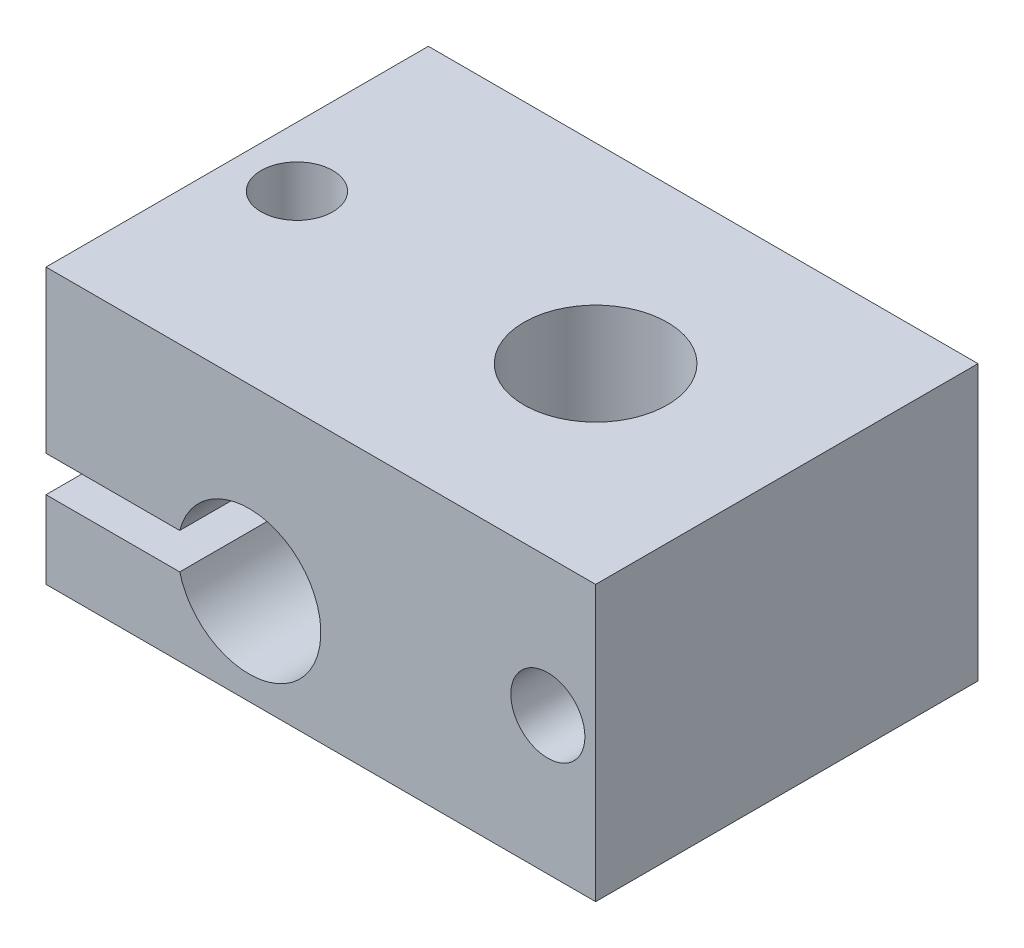
ISO-10303-21;
HEADER;
FILE_DESCRIPTION(('STEP AP214'),'2;1');
FILE_NAME('part.step','',(''),(''),'','','');
FILE_SCHEMA(('AUTOMOTIVE_DESIGN { 1 0 10303 214 1 1 1 1 }'));
ENDSEC;
DATA;
#1=APPLICATION_CONTEXT('core data for automotive mechanical design processes');
#2=APPLICATION_PROTOCOL_DEFINITION('international standard','automotive_design',2000,#1);
#3=PRODUCT_CONTEXT('',#1,'mechanical');
#4=PRODUCT('Part','Part','',(#3));
#5=PRODUCT_RELATED_PRODUCT_CATEGORY('part','',(#4));
#6=PRODUCT_DEFINITION_FORMATION('','',#4);
#7=PRODUCT_DEFINITION_CONTEXT('part definition',#1,'design');
#8=PRODUCT_DEFINITION('design','',#6,#7);
#9=PRODUCT_DEFINITION_SHAPE('','',#8);
#10=(LENGTH_UNIT() NAMED_UNIT(*) SI_UNIT(.MILLI.,.METRE.));
#11=(NAMED_UNIT(*) PLANE_ANGLE_UNIT() SI_UNIT($,.RADIAN.));
#12=(NAMED_UNIT(*) SI_UNIT($,.STERADIAN.) SOLID_ANGLE_UNIT());
#13=UNCERTAINTY_MEASURE_WITH_UNIT(LENGTH_MEASURE(1.E-05),#10,'distance_accuracy_value','');
#14=(GEOMETRIC_REPRESENTATION_CONTEXT(3) GLOBAL_UNCERTAINTY_ASSIGNED_CONTEXT((#13)) GLOBAL_UNIT_ASSIGNED_CONTEXT((#10,
#11,#12)) REPRESENTATION_CONTEXT('',''));
#15=CARTESIAN_POINT('',(0.,0.,0.));
#16=DIRECTION('',(0.,0.,1.));
#17=DIRECTION('',(1.,0.,0.));
#18=AXIS2_PLACEMENT_3D('',#15,#16,#17);
#19=CARTESIAN_POINT('',(-0.296478770186016,-0.816839986956898,16.));
#20=DIRECTION('',(0.,0.,1.));
#21=DIRECTION('',(1.,0.,0.));
#22=AXIS2_PLACEMENT_3D('',#19,#20,#21);
#23=PLANE('',#22);
#24=DIRECTION('',(0.,-1.,0.));
#25=VECTOR('',#24,1.);
#26=CARTESIAN_POINT('',(-8.79647877018601,-1.5668399869569,16.));
#27=LINE('',#26,#25);
#28=CARTESIAN_POINT('',(-8.79647877018601,-1.5668399869569,16.));
#29=VERTEX_POINT('',#28);
#30=CARTESIAN_POINT('',(-8.79647877018601,-4.8168399869569,16.));
#31=VERTEX_POINT('',#30);
#32=EDGE_CURVE('E165',#29,#31,#27,.T.);
#33=ORIENTED_EDGE('',*,*,#32,.T.);
#34=DIRECTION('',(1.,0.,0.));
#35=VECTOR('',#34,1.);
#36=CARTESIAN_POINT('',(14.203521229814,-4.8168399869569,16.));
#37=LINE('',#36,#35);
#38=CARTESIAN_POINT('',(14.203521229814,-4.8168399869569,16.));
#39=VERTEX_POINT('',#38);
#40=EDGE_CURVE('E101',#31,#39,#37,.T.);
#41=ORIENTED_EDGE('',*,*,#40,.T.);
#42=DIRECTION('',(0.,1.,0.));
#43=VECTOR('',#42,1.);
#44=CARTESIAN_POINT('',(14.203521229814,6.68316001304311,16.));
#45=LINE('',#44,#43);
#46=CARTESIAN_POINT('',(14.203521229814,6.68316001304311,16.));
#47=VERTEX_POINT('',#46);
#48=EDGE_CURVE('E187',#39,#47,#45,.T.);
#49=ORIENTED_EDGE('',*,*,#48,.T.);
#50=DIRECTION('',(-1.,0.,0.));
#51=VECTOR('',#50,1.);
#52=CARTESIAN_POINT('',(14.203521229814,6.68316001304311,16.));
#53=LINE('',#52,#51);
#54=CARTESIAN_POINT('',(-8.79647877018601,6.6831600130431,16.));
#55=VERTEX_POINT('',#54);
#56=EDGE_CURVE('E201',#47,#55,#53,.T.);
#57=ORIENTED_EDGE('',*,*,#56,.T.);
#58=DIRECTION('',(0.,-1.,0.));
#59=VECTOR('',#58,1.);
#60=CARTESIAN_POINT('',(-8.79647877018601,6.6831600130431,16.));
#61=LINE('',#60,#59);
#62=CARTESIAN_POINT('',(-8.79647877018601,-0.0668399869568986,16.));
#63=VERTEX_POINT('',#62);
#64=EDGE_CURVE('E120',#55,#63,#61,.T.);
#65=ORIENTED_EDGE('',*,*,#64,.T.);
#66=DIRECTION('',(1.,0.,0.));
#67=VECTOR('',#66,1.);
#68=CARTESIAN_POINT('',(-3.20121627984158,-0.0668399869568979,16.));
#69=LINE('',#68,#67);
#70=CARTESIAN_POINT('',(-3.20121627984158,-0.0668399869568979,16.));
#71=VERTEX_POINT('',#70);
#72=EDGE_CURVE('E114',#63,#71,#69,.T.);
#73=ORIENTED_EDGE('',*,*,#72,.T.);
#74=CARTESIAN_POINT('',(-0.296478770186016,-0.816839986956898,16.));
#75=DIRECTION('',(0.,0.,-1.));
#76=DIRECTION('',(1.,0.,0.));
#77=AXIS2_PLACEMENT_3D('',#74,#75,#76);
#78=CIRCLE('',#77,3.);
#79=CARTESIAN_POINT('',(-3.20121627984158,-1.5668399869569,16.));
#80=VERTEX_POINT('',#79);
#81=EDGE_CURVE('E118',#71,#80,#78,.T.);
#82=ORIENTED_EDGE('',*,*,#81,.T.);
#83=DIRECTION('',(-1.,0.,0.));
#84=VECTOR('',#83,1.);
#85=CARTESIAN_POINT('',(-3.20121627984158,-1.5668399869569,16.));
#86=LINE('',#85,#84);
#87=EDGE_CURVE('E58',#80,#29,#86,.T.);
#88=ORIENTED_EDGE('',*,*,#87,.T.);
#89=EDGE_LOOP('',(#33,#41,#49,#57,#65,#73,#82,#88));
#90=FACE_BOUND('',#89,.T.);
#91=CARTESIAN_POINT('',(12.203521229814,0.933160013043104,16.));
#92=DIRECTION('',(0.,0.,1.));
#93=DIRECTION('',(1.,0.,0.));
#94=AXIS2_PLACEMENT_3D('',#91,#92,#93);
#95=CIRCLE('',#94,1.55);
#96=CARTESIAN_POINT('',(13.753521229814,0.933160013043104,16.));
#97=VERTEX_POINT('',#96);
#98=EDGE_CURVE('E147',#97,#97,#95,.T.);
#99=ORIENTED_EDGE('',*,*,#98,.F.);
#100=EDGE_LOOP('',(#99));
#101=FACE_BOUND('',#100,.T.);
#102=ADVANCED_FACE('F39',(#90,#101),#23,.T.);
#103=CARTESIAN_POINT('',(-0.296478770186016,-0.816839986956898,0.));
#104=DIRECTION('',(0.,0.,1.));
#105=DIRECTION('',(1.,0.,0.));
#106=AXIS2_PLACEMENT_3D('',#103,#104,#105);
#107=PLANE('',#106);
#108=DIRECTION('',(0.,-1.,0.));
#109=VECTOR('',#108,1.);
#110=CARTESIAN_POINT('',(-8.79647877018601,-1.5668399869569,0.));
#111=LINE('',#110,#109);
#112=CARTESIAN_POINT('',(-8.79647877018601,-1.5668399869569,0.));
#113=VERTEX_POINT('',#112);
#114=CARTESIAN_POINT('',(-8.79647877018601,-4.8168399869569,0.));
#115=VERTEX_POINT('',#114);
#116=EDGE_CURVE('E142',#113,#115,#111,.T.);
#117=ORIENTED_EDGE('',*,*,#116,.F.);
#118=DIRECTION('',(-1.,0.,0.));
#119=VECTOR('',#118,1.);
#120=CARTESIAN_POINT('',(-3.20121627984158,-1.5668399869569,0.));
#121=LINE('',#120,#119);
#122=CARTESIAN_POINT('',(-3.20121627984158,-1.5668399869569,0.));
#123=VERTEX_POINT('',#122);
#124=EDGE_CURVE('E93',#123,#113,#121,.T.);
#125=ORIENTED_EDGE('',*,*,#124,.F.);
#126=CARTESIAN_POINT('',(-0.296478770186016,-0.816839986956898,0.));
#127=DIRECTION('',(0.,0.,-1.));
#128=DIRECTION('',(1.,0.,0.));
#129=AXIS2_PLACEMENT_3D('',#126,#127,#128);
#130=CIRCLE('',#129,3.);
#131=CARTESIAN_POINT('',(-3.20121627984158,-0.0668399869568979,0.));
#132=VERTEX_POINT('',#131);
#133=EDGE_CURVE('E87',#132,#123,#130,.T.);
#134=ORIENTED_EDGE('',*,*,#133,.F.);
#135=DIRECTION('',(1.,0.,0.));
#136=VECTOR('',#135,1.);
#137=CARTESIAN_POINT('',(-3.20121627984158,-0.0668399869568979,0.));
#138=LINE('',#137,#136);
#139=CARTESIAN_POINT('',(-8.79647877018601,-0.0668399869568986,0.));
#140=VERTEX_POINT('',#139);
#141=EDGE_CURVE('E129',#140,#132,#138,.T.);
#142=ORIENTED_EDGE('',*,*,#141,.F.);
#143=DIRECTION('',(0.,-1.,0.));
#144=VECTOR('',#143,1.);
#145=CARTESIAN_POINT('',(-8.79647877018601,6.6831600130431,0.));
#146=LINE('',#145,#144);
#147=CARTESIAN_POINT('',(-8.79647877018601,6.6831600130431,0.));
#148=VERTEX_POINT('',#147);
#149=EDGE_CURVE('E156',#148,#140,#146,.T.);
#150=ORIENTED_EDGE('',*,*,#149,.F.);
#151=DIRECTION('',(-1.,0.,0.));
#152=VECTOR('',#151,1.);
#153=CARTESIAN_POINT('',(14.203521229814,6.68316001304311,0.));
#154=LINE('',#153,#152);
#155=CARTESIAN_POINT('',(14.203521229814,6.68316001304311,0.));
#156=VERTEX_POINT('',#155);
#157=EDGE_CURVE('E153',#156,#148,#154,.T.);
#158=ORIENTED_EDGE('',*,*,#157,.F.);
#159=DIRECTION('',(0.,1.,0.));
#160=VECTOR('',#159,1.);
#161=CARTESIAN_POINT('',(14.203521229814,6.68316001304311,0.));
#162=LINE('',#161,#160);
#163=CARTESIAN_POINT('',(14.203521229814,-4.8168399869569,0.));
#164=VERTEX_POINT('',#163);
#165=EDGE_CURVE('E150',#164,#156,#162,.T.);
#166=ORIENTED_EDGE('',*,*,#165,.F.);
#167=DIRECTION('',(1.,0.,0.));
#168=VECTOR('',#167,1.);
#169=CARTESIAN_POINT('',(14.203521229814,-4.8168399869569,0.));
#170=LINE('',#169,#168);
#171=EDGE_CURVE('E146',#115,#164,#170,.T.);
#172=ORIENTED_EDGE('',*,*,#171,.F.);
#173=EDGE_LOOP('',(#117,#125,#134,#142,#150,#158,#166,#172));
#174=FACE_BOUND('',#173,.T.);
#175=CARTESIAN_POINT('',(12.203521229814,0.933160013043104,0.));
#176=DIRECTION('',(0.,0.,1.));
#177=DIRECTION('',(1.,0.,0.));
#178=AXIS2_PLACEMENT_3D('',#175,#176,#177);
#179=CIRCLE('',#178,1.55);
#180=CARTESIAN_POINT('',(13.753521229814,0.933160013043104,0.));
#181=VERTEX_POINT('',#180);
#182=EDGE_CURVE('E211',#181,#181,#179,.T.);
#183=ORIENTED_EDGE('',*,*,#182,.T.);
#184=EDGE_LOOP('',(#183));
#185=FACE_BOUND('',#184,.T.);
#186=ADVANCED_FACE('F191',(#174,#185),#107,.F.);
#187=CARTESIAN_POINT('',(-8.79647877018601,-1.5668399869569,16.));
#188=DIRECTION('',(1.,0.,0.));
#189=DIRECTION('',(0.,0.,-1.));
#190=AXIS2_PLACEMENT_3D('',#187,#188,#189);
#191=PLANE('',#190);
#192=ORIENTED_EDGE('',*,*,#116,.T.);
#193=DIRECTION('',(0.,0.,-1.));
#194=VECTOR('',#193,1.);
#195=CARTESIAN_POINT('',(-8.79647877018601,-4.8168399869569,16.));
#196=LINE('',#195,#194);
#197=EDGE_CURVE('E11',#31,#115,#196,.T.);
#198=ORIENTED_EDGE('',*,*,#197,.F.);
#199=ORIENTED_EDGE('',*,*,#32,.F.);
#200=DIRECTION('',(0.,0.,-1.));
#201=VECTOR('',#200,1.);
#202=CARTESIAN_POINT('',(-8.79647877018601,-1.5668399869569,16.));
#203=LINE('',#202,#201);
#204=EDGE_CURVE('E138',#29,#113,#203,.T.);
#205=ORIENTED_EDGE('',*,*,#204,.T.);
#206=EDGE_LOOP('',(#192,#198,#199,#205));
#207=FACE_BOUND('',#206,.T.);
#208=ADVANCED_FACE('F41',(#207),#191,.F.);
#209=CARTESIAN_POINT('',(14.203521229814,-4.8168399869569,16.));
#210=DIRECTION('',(0.,1.,0.));
#211=DIRECTION('',(-1.,0.,0.));
#212=AXIS2_PLACEMENT_3D('',#209,#210,#211);
#213=PLANE('',#212);
#214=CARTESIAN_POINT('',(12.203521229814,-4.8168399869569,8.));
#215=DIRECTION('',(0.,-1.,0.));
#216=DIRECTION('',(1.,0.,0.));
#217=AXIS2_PLACEMENT_3D('',#214,#215,#216);
#218=CIRCLE('',#217,1.5);
#219=CARTESIAN_POINT('',(13.703521229814,-4.8168399869569,8.));
#220=VERTEX_POINT('',#219);
#221=EDGE_CURVE('E239',#220,#220,#218,.T.);
#222=ORIENTED_EDGE('',*,*,#221,.F.);
#223=EDGE_LOOP('',(#222));
#224=FACE_BOUND('',#223,.T.);
#225=CARTESIAN_POINT('',(-6.29647877018602,-4.8168399869569,8.));
#226=DIRECTION('',(0.,1.,0.));
#227=DIRECTION('',(-1.,0.,0.));
#228=AXIS2_PLACEMENT_3D('',#225,#226,#227);
#229=CIRCLE('',#228,1.5);
#230=CARTESIAN_POINT('',(-7.79647877018602,-4.8168399869569,8.));
#231=VERTEX_POINT('',#230);
#232=EDGE_CURVE('E235',#231,#231,#229,.T.);
#233=ORIENTED_EDGE('',*,*,#232,.T.);
#234=EDGE_LOOP('',(#233));
#235=FACE_BOUND('',#234,.T.);
#236=CARTESIAN_POINT('',(6.20352122981399,-4.8168399869569,8.));
#237=DIRECTION('',(0.,1.,0.));
#238=DIRECTION('',(-1.,0.,0.));
#239=AXIS2_PLACEMENT_3D('',#236,#237,#238);
#240=CIRCLE('',#239,3.);
#241=CARTESIAN_POINT('',(3.20352122981399,-4.8168399869569,8.));
#242=VERTEX_POINT('',#241);
#243=EDGE_CURVE('E226',#242,#242,#240,.T.);
#244=ORIENTED_EDGE('',*,*,#243,.T.);
#245=EDGE_LOOP('',(#244));
#246=FACE_BOUND('',#245,.T.);
#247=ORIENTED_EDGE('',*,*,#171,.T.);
#248=DIRECTION('',(0.,0.,-1.));
#249=VECTOR('',#248,1.);
#250=CARTESIAN_POINT('',(14.203521229814,-4.8168399869569,16.));
#251=LINE('',#250,#249);
#252=EDGE_CURVE('E50',#39,#164,#251,.T.);
#253=ORIENTED_EDGE('',*,*,#252,.F.);
#254=ORIENTED_EDGE('',*,*,#40,.F.);
#255=ORIENTED_EDGE('',*,*,#197,.T.);
#256=EDGE_LOOP('',(#247,#253,#254,#255));
#257=FACE_BOUND('',#256,.T.);
#258=ADVANCED_FACE('F256',(#224,#235,#246,#257),#213,.F.);
#259=CARTESIAN_POINT('',(14.203521229814,6.68316001304311,16.));
#260=DIRECTION('',(-1.,0.,0.));
#261=DIRECTION('',(0.,-1.,0.));
#262=AXIS2_PLACEMENT_3D('',#259,#260,#261);
#263=PLANE('',#262);
#264=ORIENTED_EDGE('',*,*,#165,.T.);
#265=DIRECTION('',(0.,0.,-1.));
#266=VECTOR('',#265,1.);
#267=CARTESIAN_POINT('',(14.203521229814,6.68316001304311,16.));
#268=LINE('',#267,#266);
#269=EDGE_CURVE('E176',#47,#156,#268,.T.);
#270=ORIENTED_EDGE('',*,*,#269,.F.);
#271=ORIENTED_EDGE('',*,*,#48,.F.);
#272=ORIENTED_EDGE('',*,*,#252,.T.);
#273=EDGE_LOOP('',(#264,#270,#271,#272));
#274=FACE_BOUND('',#273,.T.);
#275=ADVANCED_FACE('F185',(#274),#263,.F.);
#276=CARTESIAN_POINT('',(14.203521229814,6.68316001304311,16.));
#277=DIRECTION('',(0.,-1.,0.));
#278=DIRECTION('',(1.,0.,0.));
#279=AXIS2_PLACEMENT_3D('',#276,#277,#278);
#280=PLANE('',#279);
#281=CARTESIAN_POINT('',(-6.29647877018602,6.6831600130431,8.));
#282=DIRECTION('',(0.,1.,0.));
#283=DIRECTION('',(-1.,0.,0.));
#284=AXIS2_PLACEMENT_3D('',#281,#282,#283);
#285=CIRCLE('',#284,1.5);
#286=CARTESIAN_POINT('',(-7.79647877018602,6.6831600130431,8.));
#287=VERTEX_POINT('',#286);
#288=EDGE_CURVE('E231',#287,#287,#285,.T.);
#289=ORIENTED_EDGE('',*,*,#288,.F.);
#290=EDGE_LOOP('',(#289));
#291=FACE_BOUND('',#290,.T.);
#292=CARTESIAN_POINT('',(6.20352122981398,6.6831600130431,8.));
#293=DIRECTION('',(0.,1.,0.));
#294=DIRECTION('',(-1.,0.,0.));
#295=AXIS2_PLACEMENT_3D('',#292,#293,#294);
#296=CIRCLE('',#295,3.);
#297=CARTESIAN_POINT('',(3.20352122981398,6.6831600130431,8.));
#298=VERTEX_POINT('',#297);
#299=EDGE_CURVE('E222',#298,#298,#296,.T.);
#300=ORIENTED_EDGE('',*,*,#299,.F.);
#301=EDGE_LOOP('',(#300));
#302=FACE_BOUND('',#301,.T.);
#303=ORIENTED_EDGE('',*,*,#157,.T.);
#304=DIRECTION('',(0.,0.,-1.));
#305=VECTOR('',#304,1.);
#306=CARTESIAN_POINT('',(-8.79647877018601,6.6831600130431,16.));
#307=LINE('',#306,#305);
#308=EDGE_CURVE('E172',#55,#148,#307,.T.);
#309=ORIENTED_EDGE('',*,*,#308,.F.);
#310=ORIENTED_EDGE('',*,*,#56,.F.);
#311=ORIENTED_EDGE('',*,*,#269,.T.);
#312=EDGE_LOOP('',(#303,#309,#310,#311));
#313=FACE_BOUND('',#312,.T.);
#314=ADVANCED_FACE('F196',(#291,#302,#313),#280,.F.);
#315=CARTESIAN_POINT('',(-8.79647877018601,6.6831600130431,16.));
#316=DIRECTION('',(1.,0.,0.));
#317=DIRECTION('',(0.,0.,-1.));
#318=AXIS2_PLACEMENT_3D('',#315,#316,#317);
#319=PLANE('',#318);
#320=ORIENTED_EDGE('',*,*,#149,.T.);
#321=DIRECTION('',(0.,0.,-1.));
#322=VECTOR('',#321,1.);
#323=CARTESIAN_POINT('',(-8.79647877018601,-0.0668399869568986,16.));
#324=LINE('',#323,#322);
#325=EDGE_CURVE('E131',#63,#140,#324,.T.);
#326=ORIENTED_EDGE('',*,*,#325,.F.);
#327=ORIENTED_EDGE('',*,*,#64,.F.);
#328=ORIENTED_EDGE('',*,*,#308,.T.);
#329=EDGE_LOOP('',(#320,#326,#327,#328));
#330=FACE_BOUND('',#329,.T.);
#331=ADVANCED_FACE('F199',(#330),#319,.F.);
#332=CARTESIAN_POINT('',(-3.20121627984158,-0.0668399869568979,16.));
#333=DIRECTION('',(0.,1.,0.));
#334=DIRECTION('',(-1.,0.,0.));
#335=AXIS2_PLACEMENT_3D('',#332,#333,#334);
#336=PLANE('',#335);
#337=CARTESIAN_POINT('',(-6.29647877018602,-0.0668399869568981,8.));
#338=DIRECTION('',(0.,1.,0.));
#339=DIRECTION('',(-1.,0.,0.));
#340=AXIS2_PLACEMENT_3D('',#337,#338,#339);
#341=CIRCLE('',#340,1.5);
#342=CARTESIAN_POINT('',(-7.79647877018602,-0.0668399869568983,8.));
#343=VERTEX_POINT('',#342);
#344=EDGE_CURVE('E215',#343,#343,#341,.T.);
#345=ORIENTED_EDGE('',*,*,#344,.T.);
#346=EDGE_LOOP('',(#345));
#347=FACE_BOUND('',#346,.T.);
#348=ORIENTED_EDGE('',*,*,#141,.T.);
#349=DIRECTION('',(0.,0.,-1.));
#350=VECTOR('',#349,1.);
#351=CARTESIAN_POINT('',(-3.20121627984158,-0.0668399869568979,16.));
#352=LINE('',#351,#350);
#353=EDGE_CURVE('E126',#71,#132,#352,.T.);
#354=ORIENTED_EDGE('',*,*,#353,.F.);
#355=ORIENTED_EDGE('',*,*,#72,.F.);
#356=ORIENTED_EDGE('',*,*,#325,.T.);
#357=EDGE_LOOP('',(#348,#354,#355,#356));
#358=FACE_BOUND('',#357,.T.);
#359=ADVANCED_FACE('F127',(#347,#358),#336,.F.);
#360=CARTESIAN_POINT('',(-0.296478770186016,-0.816839986956898,16.));
#361=DIRECTION('',(0.,0.,-1.));
#362=DIRECTION('',(-1.,0.,0.));
#363=AXIS2_PLACEMENT_3D('',#360,#361,#362);
#364=CYLINDRICAL_SURFACE('',#363,3.);
#365=ORIENTED_EDGE('',*,*,#133,.T.);
#366=DIRECTION('',(0.,0.,-1.));
#367=VECTOR('',#366,1.);
#368=CARTESIAN_POINT('',(-3.20121627984158,-1.5668399869569,16.));
#369=LINE('',#368,#367);
#370=EDGE_CURVE('E132',#80,#123,#369,.T.);
#371=ORIENTED_EDGE('',*,*,#370,.F.);
#372=ORIENTED_EDGE('',*,*,#81,.F.);
#373=ORIENTED_EDGE('',*,*,#353,.T.);
#374=EDGE_LOOP('',(#365,#371,#372,#373));
#375=FACE_BOUND('',#374,.T.);
#376=ADVANCED_FACE('F134',(#375),#364,.F.);
#377=CARTESIAN_POINT('',(-3.20121627984158,-1.5668399869569,16.));
#378=DIRECTION('',(0.,-1.,0.));
#379=DIRECTION('',(1.,0.,0.));
#380=AXIS2_PLACEMENT_3D('',#377,#378,#379);
#381=PLANE('',#380);
#382=CARTESIAN_POINT('',(-6.29647877018602,-1.5668399869569,8.));
#383=DIRECTION('',(0.,-1.,0.));
#384=DIRECTION('',(1.,0.,0.));
#385=AXIS2_PLACEMENT_3D('',#382,#383,#384);
#386=CIRCLE('',#385,1.5);
#387=CARTESIAN_POINT('',(-4.79647877018602,-1.5668399869569,8.));
#388=VERTEX_POINT('',#387);
#389=EDGE_CURVE('E43',#388,#388,#386,.T.);
#390=ORIENTED_EDGE('',*,*,#389,.T.);
#391=EDGE_LOOP('',(#390));
#392=FACE_BOUND('',#391,.T.);
#393=ORIENTED_EDGE('',*,*,#124,.T.);
#394=ORIENTED_EDGE('',*,*,#204,.F.);
#395=ORIENTED_EDGE('',*,*,#87,.F.);
#396=ORIENTED_EDGE('',*,*,#370,.T.);
#397=EDGE_LOOP('',(#393,#394,#395,#396));
#398=FACE_BOUND('',#397,.T.);
#399=ADVANCED_FACE('F265',(#392,#398),#381,.F.);
#400=CARTESIAN_POINT('',(12.203521229814,0.933160013043104,16.));
#401=DIRECTION('',(0.,0.,-1.));
#402=DIRECTION('',(-1.,0.,0.));
#403=AXIS2_PLACEMENT_3D('',#400,#401,#402);
#404=CYLINDRICAL_SURFACE('',#403,1.55);
#405=ORIENTED_EDGE('',*,*,#98,.T.);
#406=EDGE_LOOP('',(#405));
#407=FACE_BOUND('',#406,.T.);
#408=ORIENTED_EDGE('',*,*,#182,.F.);
#409=EDGE_LOOP('',(#408));
#410=FACE_BOUND('',#409,.T.);
#411=ADVANCED_FACE('F267',(#407,#410),#404,.F.);
#412=CARTESIAN_POINT('',(-6.29647877018602,-4.8168399869569,8.));
#413=DIRECTION('',(0.,1.,0.));
#414=DIRECTION('',(-1.,0.,0.));
#415=AXIS2_PLACEMENT_3D('',#412,#413,#414);
#416=CYLINDRICAL_SURFACE('',#415,1.5);
#417=ORIENTED_EDGE('',*,*,#232,.F.);
#418=EDGE_LOOP('',(#417));
#419=FACE_BOUND('',#418,.T.);
#420=ORIENTED_EDGE('',*,*,#389,.F.);
#421=EDGE_LOOP('',(#420));
#422=FACE_BOUND('',#421,.T.);
#423=ADVANCED_FACE('F274',(#419,#422),#416,.F.);
#424=ORIENTED_EDGE('',*,*,#288,.T.);
#425=EDGE_LOOP('',(#424));
#426=FACE_BOUND('',#425,.T.);
#427=ORIENTED_EDGE('',*,*,#344,.F.);
#428=EDGE_LOOP('',(#427));
#429=FACE_BOUND('',#428,.T.);
#430=ADVANCED_FACE('F288',(#426,#429),#416,.F.);
#431=CARTESIAN_POINT('',(6.20352122981399,-4.8168399869569,8.));
#432=DIRECTION('',(0.,1.,0.));
#433=DIRECTION('',(-1.,0.,0.));
#434=AXIS2_PLACEMENT_3D('',#431,#432,#433);
#435=CYLINDRICAL_SURFACE('',#434,3.);
#436=ORIENTED_EDGE('',*,*,#243,.F.);
#437=EDGE_LOOP('',(#436));
#438=FACE_BOUND('',#437,.T.);
#439=ORIENTED_EDGE('',*,*,#299,.T.);
#440=EDGE_LOOP('',(#439));
#441=FACE_BOUND('',#440,.T.);
#442=ADVANCED_FACE('F252',(#438,#441),#435,.F.);
#443=CARTESIAN_POINT('',(12.203521229814,-0.816839986956895,8.));
#444=DIRECTION('',(0.,-1.,0.));
#445=DIRECTION('',(1.,0.,0.));
#446=AXIS2_PLACEMENT_3D('',#443,#444,#445);
#447=CYLINDRICAL_SURFACE('',#446,1.5);
#448=CARTESIAN_POINT('',(12.203521229814,-0.816839986956895,8.));
#449=DIRECTION('',(0.,-1.,0.));
#450=DIRECTION('',(1.,0.,0.));
#451=AXIS2_PLACEMENT_3D('',#448,#449,#450);
#452=CIRCLE('',#451,1.5);
#453=CARTESIAN_POINT('',(13.703521229814,-0.816839986956895,8.));
#454=VERTEX_POINT('',#453);
#455=EDGE_CURVE('E227',#454,#454,#452,.T.);
#456=ORIENTED_EDGE('',*,*,#455,.F.);
#457=EDGE_LOOP('',(#456));
#458=FACE_BOUND('',#457,.T.);
#459=ORIENTED_EDGE('',*,*,#221,.T.);
#460=EDGE_LOOP('',(#459));
#461=FACE_BOUND('',#460,.T.);
#462=ADVANCED_FACE('F249',(#458,#461),#447,.F.);
#463=CARTESIAN_POINT('',(12.203521229814,-0.816839986956895,8.));
#464=DIRECTION('',(0.,-1.,0.));
#465=DIRECTION('',(1.,0.,0.));
#466=AXIS2_PLACEMENT_3D('',#463,#464,#465);
#467=PLANE('',#466);
#468=ORIENTED_EDGE('',*,*,#455,.T.);
#469=EDGE_LOOP('',(#468));
#470=FACE_BOUND('',#469,.T.);
#471=ADVANCED_FACE('F247',(#470),#467,.T.);
#472=CLOSED_SHELL('',(#102,#186,#208,#258,#275,#314,#331,#359,#376,#399,#411,#423,#430,#442,
#462,#471));
#473=MANIFOLD_SOLID_BREP('B2',#472);
#474=ADVANCED_BREP_SHAPE_REPRESENTATION('',(#18,#473),#14);
#475=SHAPE_DEFINITION_REPRESENTATION(#9,#474);
ENDSEC;
END-ISO-10303-21;
